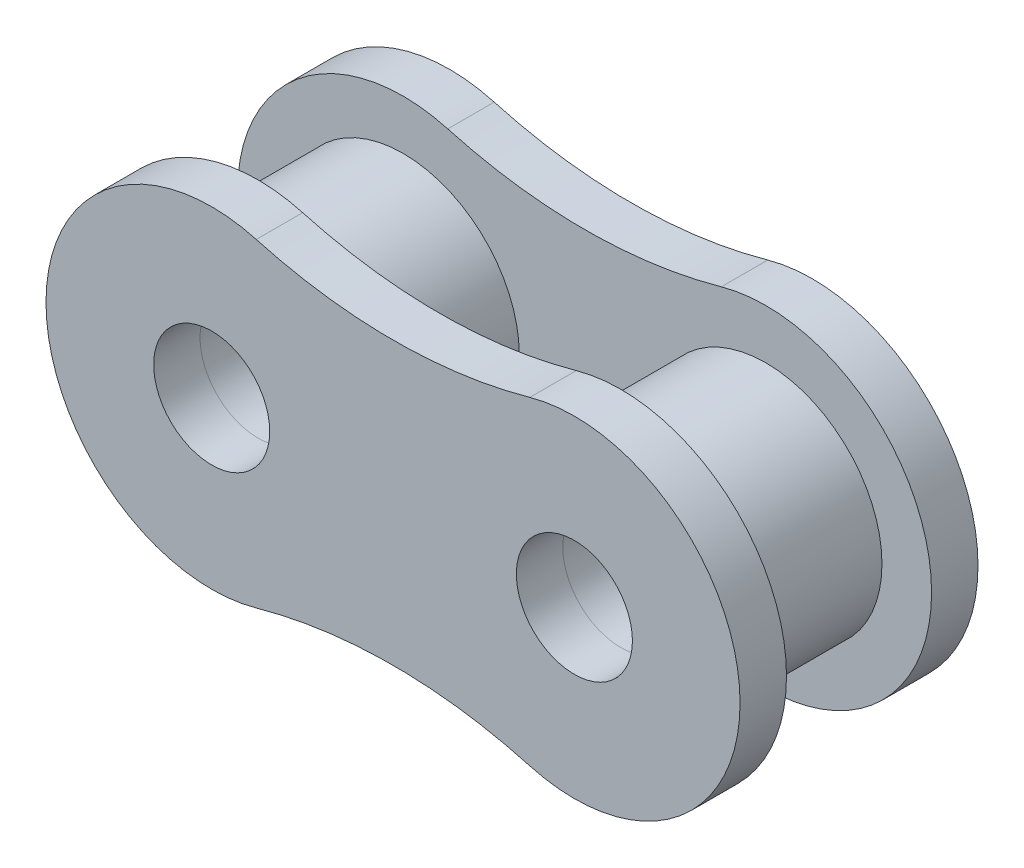
ISO-10303-21;
HEADER;
FILE_DESCRIPTION(('STEP AP214'),'2;1');
FILE_NAME('part.step','',(''),(''),'','','');
FILE_SCHEMA(('AUTOMOTIVE_DESIGN { 1 0 10303 214 1 1 1 1 }'));
ENDSEC;
DATA;
#1=APPLICATION_CONTEXT('core data for automotive mechanical design processes');
#2=APPLICATION_PROTOCOL_DEFINITION('international standard','automotive_design',2000,#1);
#3=PRODUCT_CONTEXT('',#1,'mechanical');
#4=PRODUCT('Part','Part','',(#3));
#5=PRODUCT_RELATED_PRODUCT_CATEGORY('part','',(#4));
#6=PRODUCT_DEFINITION_FORMATION('','',#4);
#7=PRODUCT_DEFINITION_CONTEXT('part definition',#1,'design');
#8=PRODUCT_DEFINITION('design','',#6,#7);
#9=PRODUCT_DEFINITION_SHAPE('','',#8);
#10=(LENGTH_UNIT() NAMED_UNIT(*) SI_UNIT(.MILLI.,.METRE.));
#11=(NAMED_UNIT(*) PLANE_ANGLE_UNIT() SI_UNIT($,.RADIAN.));
#12=(NAMED_UNIT(*) SI_UNIT($,.STERADIAN.) SOLID_ANGLE_UNIT());
#13=UNCERTAINTY_MEASURE_WITH_UNIT(LENGTH_MEASURE(1.E-05),#10,'distance_accuracy_value','');
#14=(GEOMETRIC_REPRESENTATION_CONTEXT(3) GLOBAL_UNCERTAINTY_ASSIGNED_CONTEXT((#13)) GLOBAL_UNIT_ASSIGNED_CONTEXT((#10,
#11,#12)) REPRESENTATION_CONTEXT('',''));
#15=CARTESIAN_POINT('',(0.,0.,0.));
#16=DIRECTION('',(0.,0.,1.));
#17=DIRECTION('',(1.,0.,0.));
#18=AXIS2_PLACEMENT_3D('',#15,#16,#17);
#19=CARTESIAN_POINT('',(3.96875,14.2083224875949,-5.207));
#20=DIRECTION('',(0.,0.,-1.));
#21=DIRECTION('',(1.,0.,0.));
#22=AXIS2_PLACEMENT_3D('',#19,#20,#21);
#23=PLANE('',#22);
#24=CARTESIAN_POINT('',(-7.9375,0.,-5.207));
#25=DIRECTION('',(0.,0.,1.));
#26=DIRECTION('',(1.,0.,0.));
#27=AXIS2_PLACEMENT_3D('',#24,#25,#26);
#28=CIRCLE('',#27,2.54);
#29=CARTESIAN_POINT('',(-5.3975,0.,-5.207));
#30=VERTEX_POINT('',#29);
#31=EDGE_CURVE('E116',#30,#30,#28,.T.);
#32=ORIENTED_EDGE('',*,*,#31,.T.);
#33=EDGE_LOOP('',(#32));
#34=FACE_BOUND('',#33,.T.);
#35=CARTESIAN_POINT('',(0.,28.4166449751897,-5.207));
#36=DIRECTION('',(0.,0.,-1.));
#37=DIRECTION('',(1.,0.,0.));
#38=AXIS2_PLACEMENT_3D('',#35,#36,#37);
#39=CIRCLE('',#38,22.2526999751897);
#40=CARTESIAN_POINT('',(5.98659204056336,6.9843475732388,-5.207));
#41=VERTEX_POINT('',#40);
#42=CARTESIAN_POINT('',(-5.98659204056336,6.9843475732388,-5.207));
#43=VERTEX_POINT('',#42);
#44=EDGE_CURVE('E104',#41,#43,#39,.T.);
#45=ORIENTED_EDGE('',*,*,#44,.F.);
#46=CARTESIAN_POINT('',(7.9375,0.,-5.207));
#47=DIRECTION('',(0.,0.,1.));
#48=DIRECTION('',(1.,0.,0.));
#49=AXIS2_PLACEMENT_3D('',#46,#47,#48);
#50=CIRCLE('',#49,7.2517);
#51=CARTESIAN_POINT('',(5.98659204056336,-6.9843475732388,-5.207));
#52=VERTEX_POINT('',#51);
#53=EDGE_CURVE('E107',#52,#41,#50,.T.);
#54=ORIENTED_EDGE('',*,*,#53,.F.);
#55=CARTESIAN_POINT('',(0.,-28.4166449751897,-5.207));
#56=DIRECTION('',(0.,0.,-1.));
#57=DIRECTION('',(1.,0.,0.));
#58=AXIS2_PLACEMENT_3D('',#55,#56,#57);
#59=CIRCLE('',#58,22.2526999751897);
#60=CARTESIAN_POINT('',(-5.98659204056336,-6.9843475732388,-5.207));
#61=VERTEX_POINT('',#60);
#62=EDGE_CURVE('E95',#61,#52,#59,.T.);
#63=ORIENTED_EDGE('',*,*,#62,.F.);
#64=CARTESIAN_POINT('',(-7.9375,0.,-5.207));
#65=DIRECTION('',(0.,0.,1.));
#66=DIRECTION('',(1.,0.,0.));
#67=AXIS2_PLACEMENT_3D('',#64,#65,#66);
#68=CIRCLE('',#67,7.2517);
#69=EDGE_CURVE('E100',#43,#61,#68,.T.);
#70=ORIENTED_EDGE('',*,*,#69,.F.);
#71=EDGE_LOOP('',(#45,#54,#63,#70));
#72=FACE_BOUND('',#71,.T.);
#73=CARTESIAN_POINT('',(7.9375,0.,-5.207));
#74=DIRECTION('',(0.,0.,1.));
#75=DIRECTION('',(1.,0.,0.));
#76=AXIS2_PLACEMENT_3D('',#73,#74,#75);
#77=CIRCLE('',#76,2.54);
#78=CARTESIAN_POINT('',(10.4775,0.,-5.207));
#79=VERTEX_POINT('',#78);
#80=EDGE_CURVE('E127',#79,#79,#77,.T.);
#81=ORIENTED_EDGE('',*,*,#80,.T.);
#82=EDGE_LOOP('',(#81));
#83=FACE_BOUND('',#82,.T.);
#84=ADVANCED_FACE('F48',(#34,#72,#83),#23,.T.);
#85=CARTESIAN_POINT('',(3.96875,14.2083224875949,-3.175));
#86=DIRECTION('',(0.,0.,-1.));
#87=DIRECTION('',(1.,0.,0.));
#88=AXIS2_PLACEMENT_3D('',#85,#86,#87);
#89=PLANE('',#88);
#90=CARTESIAN_POINT('',(0.,28.4166449751897,-3.175));
#91=DIRECTION('',(0.,0.,-1.));
#92=DIRECTION('',(1.,0.,0.));
#93=AXIS2_PLACEMENT_3D('',#90,#91,#92);
#94=CIRCLE('',#93,22.2526999751897);
#95=CARTESIAN_POINT('',(5.98659204056336,6.9843475732388,-3.175));
#96=VERTEX_POINT('',#95);
#97=CARTESIAN_POINT('',(-5.98659204056336,6.9843475732388,-3.175));
#98=VERTEX_POINT('',#97);
#99=EDGE_CURVE('E112',#96,#98,#94,.T.);
#100=ORIENTED_EDGE('',*,*,#99,.T.);
#101=CARTESIAN_POINT('',(-7.9375,0.,-3.175));
#102=DIRECTION('',(0.,0.,1.));
#103=DIRECTION('',(1.,0.,0.));
#104=AXIS2_PLACEMENT_3D('',#101,#102,#103);
#105=CIRCLE('',#104,7.2517);
#106=CARTESIAN_POINT('',(-5.98659204056336,-6.9843475732388,-3.175));
#107=VERTEX_POINT('',#106);
#108=EDGE_CURVE('E115',#98,#107,#105,.T.);
#109=ORIENTED_EDGE('',*,*,#108,.T.);
#110=CARTESIAN_POINT('',(0.,-28.4166449751897,-3.175));
#111=DIRECTION('',(0.,0.,-1.));
#112=DIRECTION('',(1.,0.,0.));
#113=AXIS2_PLACEMENT_3D('',#110,#111,#112);
#114=CIRCLE('',#113,22.2526999751897);
#115=CARTESIAN_POINT('',(5.98659204056336,-6.9843475732388,-3.175));
#116=VERTEX_POINT('',#115);
#117=EDGE_CURVE('E98',#107,#116,#114,.T.);
#118=ORIENTED_EDGE('',*,*,#117,.T.);
#119=CARTESIAN_POINT('',(7.9375,0.,-3.175));
#120=DIRECTION('',(0.,0.,1.));
#121=DIRECTION('',(1.,0.,0.));
#122=AXIS2_PLACEMENT_3D('',#119,#120,#121);
#123=CIRCLE('',#122,7.2517);
#124=EDGE_CURVE('E119',#116,#96,#123,.T.);
#125=ORIENTED_EDGE('',*,*,#124,.T.);
#126=EDGE_LOOP('',(#100,#109,#118,#125));
#127=FACE_BOUND('',#126,.T.);
#128=CARTESIAN_POINT('',(-7.9375,0.,-3.175));
#129=DIRECTION('',(0.,0.,1.));
#130=DIRECTION('',(1.,0.,0.));
#131=AXIS2_PLACEMENT_3D('',#128,#129,#130);
#132=CIRCLE('',#131,2.54);
#133=CARTESIAN_POINT('',(-5.3975,0.,-3.175));
#134=VERTEX_POINT('',#133);
#135=EDGE_CURVE('E124',#134,#134,#132,.T.);
#136=ORIENTED_EDGE('',*,*,#135,.F.);
#137=EDGE_LOOP('',(#136));
#138=FACE_BOUND('',#137,.T.);
#139=CARTESIAN_POINT('',(7.9375,0.,-3.175));
#140=DIRECTION('',(0.,0.,1.));
#141=DIRECTION('',(1.,0.,0.));
#142=AXIS2_PLACEMENT_3D('',#139,#140,#141);
#143=CIRCLE('',#142,2.54);
#144=CARTESIAN_POINT('',(10.4775,0.,-3.175));
#145=VERTEX_POINT('',#144);
#146=EDGE_CURVE('E130',#145,#145,#143,.T.);
#147=ORIENTED_EDGE('',*,*,#146,.F.);
#148=EDGE_LOOP('',(#147));
#149=FACE_BOUND('',#148,.T.);
#150=ADVANCED_FACE('F143',(#127,#138,#149),#89,.F.);
#151=CARTESIAN_POINT('',(0.,28.4166449751897,-5.207));
#152=DIRECTION('',(0.,0.,1.));
#153=DIRECTION('',(-1.,0.,0.));
#154=AXIS2_PLACEMENT_3D('',#151,#152,#153);
#155=CYLINDRICAL_SURFACE('',#154,22.2526999751897);
#156=ORIENTED_EDGE('',*,*,#99,.F.);
#157=DIRECTION('',(0.,0.,1.));
#158=VECTOR('',#157,1.);
#159=CARTESIAN_POINT('',(5.98659204056336,6.9843475732388,-5.207));
#160=LINE('',#159,#158);
#161=EDGE_CURVE('E65',#41,#96,#160,.T.);
#162=ORIENTED_EDGE('',*,*,#161,.F.);
#163=ORIENTED_EDGE('',*,*,#44,.T.);
#164=DIRECTION('',(0.,0.,1.));
#165=VECTOR('',#164,1.);
#166=CARTESIAN_POINT('',(-5.98659204056336,6.9843475732388,-5.207));
#167=LINE('',#166,#165);
#168=EDGE_CURVE('E12',#43,#98,#167,.T.);
#169=ORIENTED_EDGE('',*,*,#168,.T.);
#170=EDGE_LOOP('',(#156,#162,#163,#169));
#171=FACE_BOUND('',#170,.T.);
#172=ADVANCED_FACE('F50',(#171),#155,.F.);
#173=CARTESIAN_POINT('',(-7.9375,0.,-5.207));
#174=DIRECTION('',(0.,0.,1.));
#175=DIRECTION('',(-1.,0.,0.));
#176=AXIS2_PLACEMENT_3D('',#173,#174,#175);
#177=CYLINDRICAL_SURFACE('',#176,7.2517);
#178=ORIENTED_EDGE('',*,*,#108,.F.);
#179=ORIENTED_EDGE('',*,*,#168,.F.);
#180=ORIENTED_EDGE('',*,*,#69,.T.);
#181=DIRECTION('',(0.,0.,1.));
#182=VECTOR('',#181,1.);
#183=CARTESIAN_POINT('',(-5.98659204056336,-6.9843475732388,-5.207));
#184=LINE('',#183,#182);
#185=EDGE_CURVE('E57',#61,#107,#184,.T.);
#186=ORIENTED_EDGE('',*,*,#185,.T.);
#187=EDGE_LOOP('',(#178,#179,#180,#186));
#188=FACE_BOUND('',#187,.T.);
#189=ADVANCED_FACE('F101',(#188),#177,.T.);
#190=CARTESIAN_POINT('',(0.,-28.4166449751897,-5.207));
#191=DIRECTION('',(0.,0.,1.));
#192=DIRECTION('',(-1.,0.,0.));
#193=AXIS2_PLACEMENT_3D('',#190,#191,#192);
#194=CYLINDRICAL_SURFACE('',#193,22.2526999751897);
#195=ORIENTED_EDGE('',*,*,#117,.F.);
#196=ORIENTED_EDGE('',*,*,#185,.F.);
#197=ORIENTED_EDGE('',*,*,#62,.T.);
#198=DIRECTION('',(0.,0.,1.));
#199=VECTOR('',#198,1.);
#200=CARTESIAN_POINT('',(5.98659204056336,-6.9843475732388,-5.207));
#201=LINE('',#200,#199);
#202=EDGE_CURVE('E81',#52,#116,#201,.T.);
#203=ORIENTED_EDGE('',*,*,#202,.T.);
#204=EDGE_LOOP('',(#195,#196,#197,#203));
#205=FACE_BOUND('',#204,.T.);
#206=ADVANCED_FACE('F93',(#205),#194,.F.);
#207=CARTESIAN_POINT('',(7.9375,0.,-5.207));
#208=DIRECTION('',(0.,0.,1.));
#209=DIRECTION('',(-1.,0.,0.));
#210=AXIS2_PLACEMENT_3D('',#207,#208,#209);
#211=CYLINDRICAL_SURFACE('',#210,7.2517);
#212=ORIENTED_EDGE('',*,*,#124,.F.);
#213=ORIENTED_EDGE('',*,*,#202,.F.);
#214=ORIENTED_EDGE('',*,*,#53,.T.);
#215=ORIENTED_EDGE('',*,*,#161,.T.);
#216=EDGE_LOOP('',(#212,#213,#214,#215));
#217=FACE_BOUND('',#216,.T.);
#218=ADVANCED_FACE('F155',(#217),#211,.T.);
#219=CARTESIAN_POINT('',(-7.9375,0.,-5.207));
#220=DIRECTION('',(0.,0.,1.));
#221=DIRECTION('',(-1.,0.,0.));
#222=AXIS2_PLACEMENT_3D('',#219,#220,#221);
#223=CYLINDRICAL_SURFACE('',#222,2.54);
#224=ORIENTED_EDGE('',*,*,#31,.F.);
#225=EDGE_LOOP('',(#224));
#226=FACE_BOUND('',#225,.T.);
#227=ORIENTED_EDGE('',*,*,#135,.T.);
#228=EDGE_LOOP('',(#227));
#229=FACE_BOUND('',#228,.T.);
#230=ADVANCED_FACE('F139',(#226,#229),#223,.F.);
#231=CARTESIAN_POINT('',(7.9375,0.,-5.207));
#232=DIRECTION('',(0.,0.,1.));
#233=DIRECTION('',(-1.,0.,0.));
#234=AXIS2_PLACEMENT_3D('',#231,#232,#233);
#235=CYLINDRICAL_SURFACE('',#234,2.54);
#236=ORIENTED_EDGE('',*,*,#80,.F.);
#237=EDGE_LOOP('',(#236));
#238=FACE_BOUND('',#237,.T.);
#239=ORIENTED_EDGE('',*,*,#146,.T.);
#240=EDGE_LOOP('',(#239));
#241=FACE_BOUND('',#240,.T.);
#242=ADVANCED_FACE('F136',(#238,#241),#235,.F.);
#243=CLOSED_SHELL('',(#84,#150,#172,#189,#206,#218,#230,#242));
#244=MANIFOLD_SOLID_BREP('B2',#243);
#245=CARTESIAN_POINT('',(3.96875,14.2083224875949,5.207));
#246=DIRECTION('',(0.,0.,1.));
#247=DIRECTION('',(1.,0.,0.));
#248=AXIS2_PLACEMENT_3D('',#245,#246,#247);
#249=PLANE('',#248);
#250=CARTESIAN_POINT('',(-7.9375,0.,5.207));
#251=DIRECTION('',(0.,0.,1.));
#252=DIRECTION('',(1.,0.,0.));
#253=AXIS2_PLACEMENT_3D('',#250,#251,#252);
#254=CIRCLE('',#253,2.54);
#255=CARTESIAN_POINT('',(-5.3975,0.,5.207));
#256=VERTEX_POINT('',#255);
#257=EDGE_CURVE('E305',#256,#256,#254,.T.);
#258=ORIENTED_EDGE('',*,*,#257,.F.);
#259=EDGE_LOOP('',(#258));
#260=FACE_BOUND('',#259,.T.);
#261=CARTESIAN_POINT('',(0.,28.4166449751897,5.207));
#262=DIRECTION('',(0.,0.,-1.));
#263=DIRECTION('',(1.,0.,0.));
#264=AXIS2_PLACEMENT_3D('',#261,#262,#263);
#265=CIRCLE('',#264,22.2526999751897);
#266=CARTESIAN_POINT('',(5.98659204056336,6.9843475732388,5.207));
#267=VERTEX_POINT('',#266);
#268=CARTESIAN_POINT('',(-5.98659204056336,6.9843475732388,5.207));
#269=VERTEX_POINT('',#268);
#270=EDGE_CURVE('E290',#267,#269,#265,.T.);
#271=ORIENTED_EDGE('',*,*,#270,.T.);
#272=CARTESIAN_POINT('',(-7.9375,0.,5.207));
#273=DIRECTION('',(0.,0.,1.));
#274=DIRECTION('',(1.,0.,0.));
#275=AXIS2_PLACEMENT_3D('',#272,#273,#274);
#276=CIRCLE('',#275,7.2517);
#277=CARTESIAN_POINT('',(-5.98659204056336,-6.9843475732388,5.207));
#278=VERTEX_POINT('',#277);
#279=EDGE_CURVE('E285',#269,#278,#276,.T.);
#280=ORIENTED_EDGE('',*,*,#279,.T.);
#281=CARTESIAN_POINT('',(0.,-28.4166449751897,5.207));
#282=DIRECTION('',(0.,0.,-1.));
#283=DIRECTION('',(1.,0.,0.));
#284=AXIS2_PLACEMENT_3D('',#281,#282,#283);
#285=CIRCLE('',#284,22.2526999751897);
#286=CARTESIAN_POINT('',(5.98659204056336,-6.9843475732388,5.207));
#287=VERTEX_POINT('',#286);
#288=EDGE_CURVE('E288',#278,#287,#285,.T.);
#289=ORIENTED_EDGE('',*,*,#288,.T.);
#290=CARTESIAN_POINT('',(7.9375,0.,5.207));
#291=DIRECTION('',(0.,0.,1.));
#292=DIRECTION('',(1.,0.,0.));
#293=AXIS2_PLACEMENT_3D('',#290,#291,#292);
#294=CIRCLE('',#293,7.2517);
#295=EDGE_CURVE('E255',#287,#267,#294,.T.);
#296=ORIENTED_EDGE('',*,*,#295,.T.);
#297=EDGE_LOOP('',(#271,#280,#289,#296));
#298=FACE_BOUND('',#297,.T.);
#299=CARTESIAN_POINT('',(7.9375,0.,5.207));
#300=DIRECTION('',(0.,0.,1.));
#301=DIRECTION('',(1.,0.,0.));
#302=AXIS2_PLACEMENT_3D('',#299,#300,#301);
#303=CIRCLE('',#302,2.54);
#304=CARTESIAN_POINT('',(10.4775,0.,5.207));
#305=VERTEX_POINT('',#304);
#306=EDGE_CURVE('E320',#305,#305,#303,.T.);
#307=ORIENTED_EDGE('',*,*,#306,.F.);
#308=EDGE_LOOP('',(#307));
#309=FACE_BOUND('',#308,.T.);
#310=ADVANCED_FACE('F238',(#260,#298,#309),#249,.T.);
#311=CARTESIAN_POINT('',(3.96875,14.2083224875949,3.175));
#312=DIRECTION('',(0.,0.,1.));
#313=DIRECTION('',(1.,0.,0.));
#314=AXIS2_PLACEMENT_3D('',#311,#312,#313);
#315=PLANE('',#314);
#316=CARTESIAN_POINT('',(0.,28.4166449751897,3.175));
#317=DIRECTION('',(0.,0.,-1.));
#318=DIRECTION('',(1.,0.,0.));
#319=AXIS2_PLACEMENT_3D('',#316,#317,#318);
#320=CIRCLE('',#319,22.2526999751897);
#321=CARTESIAN_POINT('',(5.98659204056336,6.9843475732388,3.175));
#322=VERTEX_POINT('',#321);
#323=CARTESIAN_POINT('',(-5.98659204056336,6.9843475732388,3.175));
#324=VERTEX_POINT('',#323);
#325=EDGE_CURVE('E302',#322,#324,#320,.T.);
#326=ORIENTED_EDGE('',*,*,#325,.F.);
#327=CARTESIAN_POINT('',(7.9375,0.,3.175));
#328=DIRECTION('',(0.,0.,1.));
#329=DIRECTION('',(1.,0.,0.));
#330=AXIS2_PLACEMENT_3D('',#327,#328,#329);
#331=CIRCLE('',#330,7.2517);
#332=CARTESIAN_POINT('',(5.98659204056336,-6.9843475732388,3.175));
#333=VERTEX_POINT('',#332);
#334=EDGE_CURVE('E278',#333,#322,#331,.T.);
#335=ORIENTED_EDGE('',*,*,#334,.F.);
#336=CARTESIAN_POINT('',(0.,-28.4166449751897,3.175));
#337=DIRECTION('',(0.,0.,-1.));
#338=DIRECTION('',(1.,0.,0.));
#339=AXIS2_PLACEMENT_3D('',#336,#337,#338);
#340=CIRCLE('',#339,22.2526999751897);
#341=CARTESIAN_POINT('',(-5.98659204056336,-6.9843475732388,3.175));
#342=VERTEX_POINT('',#341);
#343=EDGE_CURVE('E272',#342,#333,#340,.T.);
#344=ORIENTED_EDGE('',*,*,#343,.F.);
#345=CARTESIAN_POINT('',(-7.9375,0.,3.175));
#346=DIRECTION('',(0.,0.,1.));
#347=DIRECTION('',(1.,0.,0.));
#348=AXIS2_PLACEMENT_3D('',#345,#346,#347);
#349=CIRCLE('',#348,7.2517);
#350=EDGE_CURVE('E294',#324,#342,#349,.T.);
#351=ORIENTED_EDGE('',*,*,#350,.F.);
#352=EDGE_LOOP('',(#326,#335,#344,#351));
#353=FACE_BOUND('',#352,.T.);
#354=CARTESIAN_POINT('',(-7.9375,0.,3.175));
#355=DIRECTION('',(0.,0.,1.));
#356=DIRECTION('',(1.,0.,0.));
#357=AXIS2_PLACEMENT_3D('',#354,#355,#356);
#358=CIRCLE('',#357,2.54);
#359=CARTESIAN_POINT('',(-5.3975,0.,3.175));
#360=VERTEX_POINT('',#359);
#361=EDGE_CURVE('E317',#360,#360,#358,.T.);
#362=ORIENTED_EDGE('',*,*,#361,.T.);
#363=EDGE_LOOP('',(#362));
#364=FACE_BOUND('',#363,.T.);
#365=CARTESIAN_POINT('',(7.9375,0.,3.175));
#366=DIRECTION('',(0.,0.,1.));
#367=DIRECTION('',(1.,0.,0.));
#368=AXIS2_PLACEMENT_3D('',#365,#366,#367);
#369=CIRCLE('',#368,2.54);
#370=CARTESIAN_POINT('',(10.4775,0.,3.175));
#371=VERTEX_POINT('',#370);
#372=EDGE_CURVE('E323',#371,#371,#369,.T.);
#373=ORIENTED_EDGE('',*,*,#372,.T.);
#374=EDGE_LOOP('',(#373));
#375=FACE_BOUND('',#374,.T.);
#376=ADVANCED_FACE('F313',(#353,#364,#375),#315,.F.);
#377=CARTESIAN_POINT('',(0.,28.4166449751897,5.207));
#378=DIRECTION('',(0.,0.,-1.));
#379=DIRECTION('',(-1.,0.,0.));
#380=AXIS2_PLACEMENT_3D('',#377,#378,#379);
#381=CYLINDRICAL_SURFACE('',#380,22.2526999751897);
#382=ORIENTED_EDGE('',*,*,#325,.T.);
#383=DIRECTION('',(0.,0.,-1.));
#384=VECTOR('',#383,1.);
#385=CARTESIAN_POINT('',(-5.98659204056336,6.9843475732388,5.207));
#386=LINE('',#385,#384);
#387=EDGE_CURVE('E46',#269,#324,#386,.T.);
#388=ORIENTED_EDGE('',*,*,#387,.F.);
#389=ORIENTED_EDGE('',*,*,#270,.F.);
#390=DIRECTION('',(0.,0.,-1.));
#391=VECTOR('',#390,1.);
#392=CARTESIAN_POINT('',(5.98659204056336,6.9843475732388,5.207));
#393=LINE('',#392,#391);
#394=EDGE_CURVE('E298',#267,#322,#393,.T.);
#395=ORIENTED_EDGE('',*,*,#394,.T.);
#396=EDGE_LOOP('',(#382,#388,#389,#395));
#397=FACE_BOUND('',#396,.T.);
#398=ADVANCED_FACE('F240',(#397),#381,.F.);
#399=CARTESIAN_POINT('',(-7.9375,0.,5.207));
#400=DIRECTION('',(0.,0.,-1.));
#401=DIRECTION('',(-1.,0.,0.));
#402=AXIS2_PLACEMENT_3D('',#399,#400,#401);
#403=CYLINDRICAL_SURFACE('',#402,7.2517);
#404=ORIENTED_EDGE('',*,*,#350,.T.);
#405=DIRECTION('',(0.,0.,-1.));
#406=VECTOR('',#405,1.);
#407=CARTESIAN_POINT('',(-5.98659204056336,-6.9843475732388,5.207));
#408=LINE('',#407,#406);
#409=EDGE_CURVE('E247',#278,#342,#408,.T.);
#410=ORIENTED_EDGE('',*,*,#409,.F.);
#411=ORIENTED_EDGE('',*,*,#279,.F.);
#412=ORIENTED_EDGE('',*,*,#387,.T.);
#413=EDGE_LOOP('',(#404,#410,#411,#412));
#414=FACE_BOUND('',#413,.T.);
#415=ADVANCED_FACE('F293',(#414),#403,.T.);
#416=CARTESIAN_POINT('',(0.,-28.4166449751897,5.207));
#417=DIRECTION('',(0.,0.,-1.));
#418=DIRECTION('',(-1.,0.,0.));
#419=AXIS2_PLACEMENT_3D('',#416,#417,#418);
#420=CYLINDRICAL_SURFACE('',#419,22.2526999751897);
#421=ORIENTED_EDGE('',*,*,#343,.T.);
#422=DIRECTION('',(0.,0.,-1.));
#423=VECTOR('',#422,1.);
#424=CARTESIAN_POINT('',(5.98659204056336,-6.9843475732388,5.207));
#425=LINE('',#424,#423);
#426=EDGE_CURVE('E295',#287,#333,#425,.T.);
#427=ORIENTED_EDGE('',*,*,#426,.F.);
#428=ORIENTED_EDGE('',*,*,#288,.F.);
#429=ORIENTED_EDGE('',*,*,#409,.T.);
#430=EDGE_LOOP('',(#421,#427,#428,#429));
#431=FACE_BOUND('',#430,.T.);
#432=ADVANCED_FACE('F296',(#431),#420,.F.);
#433=CARTESIAN_POINT('',(7.9375,0.,5.207));
#434=DIRECTION('',(0.,0.,-1.));
#435=DIRECTION('',(-1.,0.,0.));
#436=AXIS2_PLACEMENT_3D('',#433,#434,#435);
#437=CYLINDRICAL_SURFACE('',#436,7.2517);
#438=ORIENTED_EDGE('',*,*,#334,.T.);
#439=ORIENTED_EDGE('',*,*,#394,.F.);
#440=ORIENTED_EDGE('',*,*,#295,.F.);
#441=ORIENTED_EDGE('',*,*,#426,.T.);
#442=EDGE_LOOP('',(#438,#439,#440,#441));
#443=FACE_BOUND('',#442,.T.);
#444=ADVANCED_FACE('F310',(#443),#437,.T.);
#445=CARTESIAN_POINT('',(-7.9375,0.,5.207));
#446=DIRECTION('',(0.,0.,-1.));
#447=DIRECTION('',(-1.,0.,0.));
#448=AXIS2_PLACEMENT_3D('',#445,#446,#447);
#449=CYLINDRICAL_SURFACE('',#448,2.54);
#450=ORIENTED_EDGE('',*,*,#257,.T.);
#451=EDGE_LOOP('',(#450));
#452=FACE_BOUND('',#451,.T.);
#453=ORIENTED_EDGE('',*,*,#361,.F.);
#454=EDGE_LOOP('',(#453));
#455=FACE_BOUND('',#454,.T.);
#456=ADVANCED_FACE('F340',(#452,#455),#449,.F.);
#457=CARTESIAN_POINT('',(7.9375,0.,5.207));
#458=DIRECTION('',(0.,0.,-1.));
#459=DIRECTION('',(-1.,0.,0.));
#460=AXIS2_PLACEMENT_3D('',#457,#458,#459);
#461=CYLINDRICAL_SURFACE('',#460,2.54);
#462=ORIENTED_EDGE('',*,*,#306,.T.);
#463=EDGE_LOOP('',(#462));
#464=FACE_BOUND('',#463,.T.);
#465=ORIENTED_EDGE('',*,*,#372,.F.);
#466=EDGE_LOOP('',(#465));
#467=FACE_BOUND('',#466,.T.);
#468=ADVANCED_FACE('F329',(#464,#467),#461,.F.);
#469=CLOSED_SHELL('',(#310,#376,#398,#415,#432,#444,#456,#468));
#470=MANIFOLD_SOLID_BREP('B6',#469);
#471=CARTESIAN_POINT('',(7.9375,0.,3.175));
#472=DIRECTION('',(0.,0.,1.));
#473=DIRECTION('',(1.,0.,0.));
#474=AXIS2_PLACEMENT_3D('',#471,#472,#473);
#475=PLANE('',#474);
#476=CARTESIAN_POINT('',(7.9375,0.,3.175));
#477=DIRECTION('',(0.,0.,1.));
#478=DIRECTION('',(1.,0.,0.));
#479=AXIS2_PLACEMENT_3D('',#476,#477,#478);
#480=CIRCLE('',#479,5.08);
#481=CARTESIAN_POINT('',(13.0175,0.,3.175));
#482=VERTEX_POINT('',#481);
#483=EDGE_CURVE('E237',#482,#482,#480,.T.);
#484=ORIENTED_EDGE('',*,*,#483,.T.);
#485=EDGE_LOOP('',(#484));
#486=FACE_BOUND('',#485,.T.);
#487=CARTESIAN_POINT('',(7.9375,0.,3.175));
#488=DIRECTION('',(0.,0.,1.));
#489=DIRECTION('',(1.,0.,0.));
#490=AXIS2_PLACEMENT_3D('',#487,#488,#489);
#491=CIRCLE('',#490,2.5654);
#492=CARTESIAN_POINT('',(10.5029,0.,3.175));
#493=VERTEX_POINT('',#492);
#494=EDGE_CURVE('E438',#493,#493,#491,.T.);
#495=ORIENTED_EDGE('',*,*,#494,.F.);
#496=EDGE_LOOP('',(#495));
#497=FACE_BOUND('',#496,.T.);
#498=ADVANCED_FACE('F427',(#486,#497),#475,.T.);
#499=CARTESIAN_POINT('',(7.9375,0.,-3.175));
#500=DIRECTION('',(0.,0.,1.));
#501=DIRECTION('',(1.,0.,0.));
#502=AXIS2_PLACEMENT_3D('',#499,#500,#501);
#503=PLANE('',#502);
#504=CARTESIAN_POINT('',(7.9375,0.,-3.175));
#505=DIRECTION('',(0.,0.,1.));
#506=DIRECTION('',(1.,0.,0.));
#507=AXIS2_PLACEMENT_3D('',#504,#505,#506);
#508=CIRCLE('',#507,5.08);
#509=CARTESIAN_POINT('',(13.0175,0.,-3.175));
#510=VERTEX_POINT('',#509);
#511=EDGE_CURVE('E431',#510,#510,#508,.T.);
#512=ORIENTED_EDGE('',*,*,#511,.F.);
#513=EDGE_LOOP('',(#512));
#514=FACE_BOUND('',#513,.T.);
#515=CARTESIAN_POINT('',(7.9375,0.,-3.175));
#516=DIRECTION('',(0.,0.,1.));
#517=DIRECTION('',(1.,0.,0.));
#518=AXIS2_PLACEMENT_3D('',#515,#516,#517);
#519=CIRCLE('',#518,2.5654);
#520=CARTESIAN_POINT('',(10.5029,0.,-3.175));
#521=VERTEX_POINT('',#520);
#522=EDGE_CURVE('E440',#521,#521,#519,.T.);
#523=ORIENTED_EDGE('',*,*,#522,.T.);
#524=EDGE_LOOP('',(#523));
#525=FACE_BOUND('',#524,.T.);
#526=ADVANCED_FACE('F450',(#514,#525),#503,.F.);
#527=CARTESIAN_POINT('',(7.9375,0.,3.175));
#528=DIRECTION('',(0.,0.,-1.));
#529=DIRECTION('',(-1.,0.,0.));
#530=AXIS2_PLACEMENT_3D('',#527,#528,#529);
#531=CYLINDRICAL_SURFACE('',#530,5.08);
#532=ORIENTED_EDGE('',*,*,#483,.F.);
#533=EDGE_LOOP('',(#532));
#534=FACE_BOUND('',#533,.T.);
#535=ORIENTED_EDGE('',*,*,#511,.T.);
#536=EDGE_LOOP('',(#535));
#537=FACE_BOUND('',#536,.T.);
#538=ADVANCED_FACE('F429',(#534,#537),#531,.T.);
#539=CARTESIAN_POINT('',(7.9375,0.,3.175));
#540=DIRECTION('',(0.,0.,-1.));
#541=DIRECTION('',(-1.,0.,0.));
#542=AXIS2_PLACEMENT_3D('',#539,#540,#541);
#543=CYLINDRICAL_SURFACE('',#542,2.5654);
#544=ORIENTED_EDGE('',*,*,#494,.T.);
#545=EDGE_LOOP('',(#544));
#546=FACE_BOUND('',#545,.T.);
#547=ORIENTED_EDGE('',*,*,#522,.F.);
#548=EDGE_LOOP('',(#547));
#549=FACE_BOUND('',#548,.T.);
#550=ADVANCED_FACE('F446',(#546,#549),#543,.F.);
#551=CLOSED_SHELL('',(#498,#526,#538,#550));
#552=MANIFOLD_SOLID_BREP('B40',#551);
#553=CARTESIAN_POINT('',(-7.9375,0.,3.175));
#554=DIRECTION('',(0.,0.,1.));
#555=DIRECTION('',(1.,0.,0.));
#556=AXIS2_PLACEMENT_3D('',#553,#554,#555);
#557=PLANE('',#556);
#558=CARTESIAN_POINT('',(-7.9375,0.,3.175));
#559=DIRECTION('',(0.,0.,1.));
#560=DIRECTION('',(1.,0.,0.));
#561=AXIS2_PLACEMENT_3D('',#558,#559,#560);
#562=CIRCLE('',#561,5.08);
#563=CARTESIAN_POINT('',(-2.8575,0.,3.175));
#564=VERTEX_POINT('',#563);
#565=EDGE_CURVE('E426',#564,#564,#562,.T.);
#566=ORIENTED_EDGE('',*,*,#565,.T.);
#567=EDGE_LOOP('',(#566));
#568=FACE_BOUND('',#567,.T.);
#569=CARTESIAN_POINT('',(-7.9375,0.,3.175));
#570=DIRECTION('',(0.,0.,1.));
#571=DIRECTION('',(1.,0.,0.));
#572=AXIS2_PLACEMENT_3D('',#569,#570,#571);
#573=CIRCLE('',#572,2.5654);
#574=CARTESIAN_POINT('',(-5.3721,0.,3.175));
#575=VERTEX_POINT('',#574);
#576=EDGE_CURVE('E508',#575,#575,#573,.T.);
#577=ORIENTED_EDGE('',*,*,#576,.F.);
#578=EDGE_LOOP('',(#577));
#579=FACE_BOUND('',#578,.T.);
#580=ADVANCED_FACE('F497',(#568,#579),#557,.T.);
#581=CARTESIAN_POINT('',(-7.9375,0.,-3.175));
#582=DIRECTION('',(0.,0.,1.));
#583=DIRECTION('',(1.,0.,0.));
#584=AXIS2_PLACEMENT_3D('',#581,#582,#583);
#585=PLANE('',#584);
#586=CARTESIAN_POINT('',(-7.9375,0.,-3.175));
#587=DIRECTION('',(0.,0.,1.));
#588=DIRECTION('',(1.,0.,0.));
#589=AXIS2_PLACEMENT_3D('',#586,#587,#588);
#590=CIRCLE('',#589,5.08);
#591=CARTESIAN_POINT('',(-2.8575,0.,-3.175));
#592=VERTEX_POINT('',#591);
#593=EDGE_CURVE('E501',#592,#592,#590,.T.);
#594=ORIENTED_EDGE('',*,*,#593,.F.);
#595=EDGE_LOOP('',(#594));
#596=FACE_BOUND('',#595,.T.);
#597=CARTESIAN_POINT('',(-7.9375,0.,-3.175));
#598=DIRECTION('',(0.,0.,1.));
#599=DIRECTION('',(1.,0.,0.));
#600=AXIS2_PLACEMENT_3D('',#597,#598,#599);
#601=CIRCLE('',#600,2.5654);
#602=CARTESIAN_POINT('',(-5.3721,0.,-3.175));
#603=VERTEX_POINT('',#602);
#604=EDGE_CURVE('E510',#603,#603,#601,.T.);
#605=ORIENTED_EDGE('',*,*,#604,.T.);
#606=EDGE_LOOP('',(#605));
#607=FACE_BOUND('',#606,.T.);
#608=ADVANCED_FACE('F520',(#596,#607),#585,.F.);
#609=CARTESIAN_POINT('',(-7.9375,0.,3.175));
#610=DIRECTION('',(0.,0.,-1.));
#611=DIRECTION('',(-1.,0.,0.));
#612=AXIS2_PLACEMENT_3D('',#609,#610,#611);
#613=CYLINDRICAL_SURFACE('',#612,5.08);
#614=ORIENTED_EDGE('',*,*,#565,.F.);
#615=EDGE_LOOP('',(#614));
#616=FACE_BOUND('',#615,.T.);
#617=ORIENTED_EDGE('',*,*,#593,.T.);
#618=EDGE_LOOP('',(#617));
#619=FACE_BOUND('',#618,.T.);
#620=ADVANCED_FACE('F499',(#616,#619),#613,.T.);
#621=CARTESIAN_POINT('',(-7.9375,0.,3.175));
#622=DIRECTION('',(0.,0.,-1.));
#623=DIRECTION('',(-1.,0.,0.));
#624=AXIS2_PLACEMENT_3D('',#621,#622,#623);
#625=CYLINDRICAL_SURFACE('',#624,2.5654);
#626=ORIENTED_EDGE('',*,*,#576,.T.);
#627=EDGE_LOOP('',(#626));
#628=FACE_BOUND('',#627,.T.);
#629=ORIENTED_EDGE('',*,*,#604,.F.);
#630=EDGE_LOOP('',(#629));
#631=FACE_BOUND('',#630,.T.);
#632=ADVANCED_FACE('F516',(#628,#631),#625,.F.);
#633=CLOSED_SHELL('',(#580,#608,#620,#632));
#634=MANIFOLD_SOLID_BREP('B232',#633);
#635=ADVANCED_BREP_SHAPE_REPRESENTATION('',(#18,#244,#470,#552,#634),#14);
#636=SHAPE_DEFINITION_REPRESENTATION(#9,#635);
ENDSEC;
END-ISO-10303-21;
